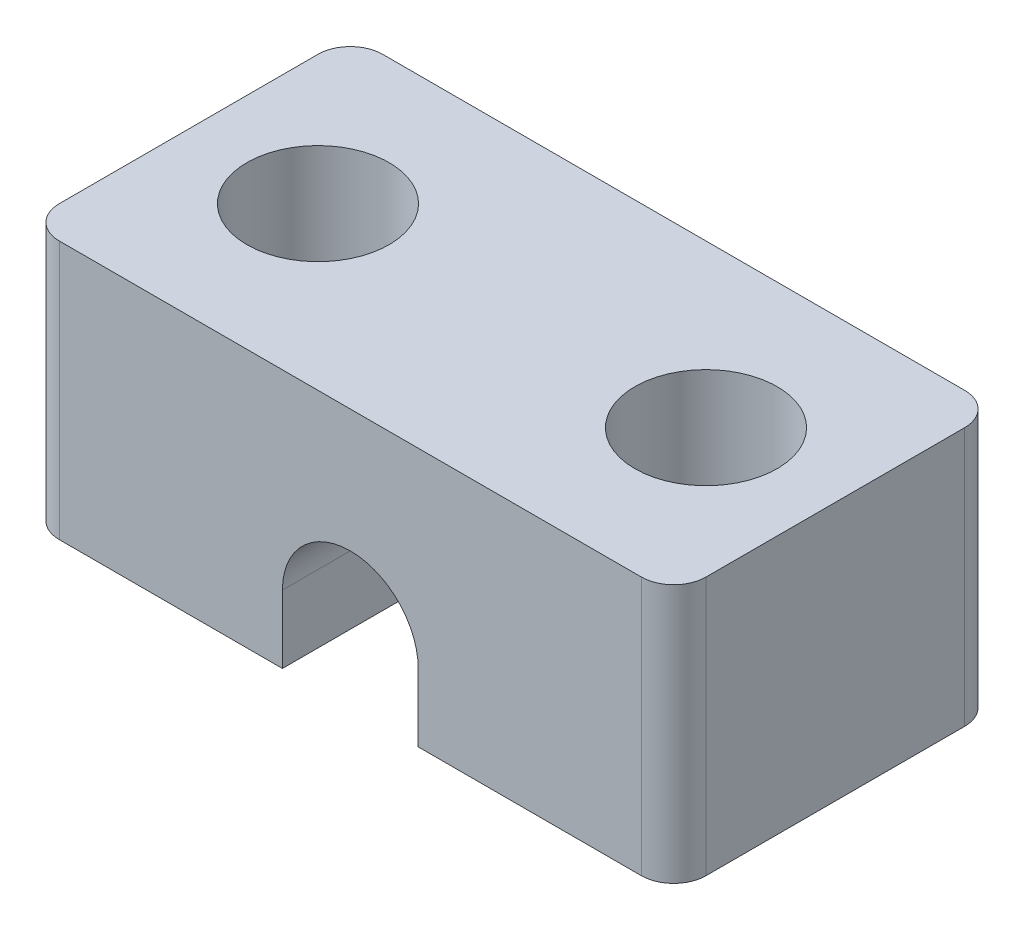
ISO-10303-21;
HEADER;
FILE_DESCRIPTION(('STEP AP214'),'2;1');
FILE_NAME('part.step','',(''),(''),'','','');
FILE_SCHEMA(('AUTOMOTIVE_DESIGN { 1 0 10303 214 1 1 1 1 }'));
ENDSEC;
DATA;
#1=APPLICATION_CONTEXT('core data for automotive mechanical design processes');
#2=APPLICATION_PROTOCOL_DEFINITION('international standard','automotive_design',2000,#1);
#3=PRODUCT_CONTEXT('',#1,'mechanical');
#4=PRODUCT('Part','Part','',(#3));
#5=PRODUCT_RELATED_PRODUCT_CATEGORY('part','',(#4));
#6=PRODUCT_DEFINITION_FORMATION('','',#4);
#7=PRODUCT_DEFINITION_CONTEXT('part definition',#1,'design');
#8=PRODUCT_DEFINITION('design','',#6,#7);
#9=PRODUCT_DEFINITION_SHAPE('','',#8);
#10=(LENGTH_UNIT() NAMED_UNIT(*) SI_UNIT(.MILLI.,.METRE.));
#11=(NAMED_UNIT(*) PLANE_ANGLE_UNIT() SI_UNIT($,.RADIAN.));
#12=(NAMED_UNIT(*) SI_UNIT($,.STERADIAN.) SOLID_ANGLE_UNIT());
#13=UNCERTAINTY_MEASURE_WITH_UNIT(LENGTH_MEASURE(1.E-05),#10,'distance_accuracy_value','');
#14=(GEOMETRIC_REPRESENTATION_CONTEXT(3) GLOBAL_UNCERTAINTY_ASSIGNED_CONTEXT((#13)) GLOBAL_UNIT_ASSIGNED_CONTEXT((#10,
#11,#12)) REPRESENTATION_CONTEXT('',''));
#15=CARTESIAN_POINT('',(0.,0.,0.));
#16=DIRECTION('',(0.,0.,1.));
#17=DIRECTION('',(1.,0.,0.));
#18=AXIS2_PLACEMENT_3D('',#15,#16,#17);
#19=CARTESIAN_POINT('',(-2.1,0.,5.));
#20=DIRECTION('',(-1.,0.,0.));
#21=DIRECTION('',(0.,-1.,0.));
#22=AXIS2_PLACEMENT_3D('',#19,#20,#21);
#23=PLANE('',#22);
#24=DIRECTION('',(0.,1.,0.));
#25=VECTOR('',#24,1.);
#26=CARTESIAN_POINT('',(-2.1,-2.1,0.799999999999999));
#27=LINE('',#26,#25);
#28=CARTESIAN_POINT('',(-2.1,-2.1,0.799999999999999));
#29=VERTEX_POINT('',#28);
#30=CARTESIAN_POINT('',(-2.1,0.,0.799999999999999));
#31=VERTEX_POINT('',#30);
#32=EDGE_CURVE('E261',#29,#31,#27,.T.);
#33=ORIENTED_EDGE('',*,*,#32,.T.);
#34=DIRECTION('',(0.,0.,-1.));
#35=VECTOR('',#34,1.);
#36=CARTESIAN_POINT('',(-2.1,0.,5.));
#37=LINE('',#36,#35);
#38=CARTESIAN_POINT('',(-2.1,0.,5.));
#39=VERTEX_POINT('',#38);
#40=EDGE_CURVE('E148',#39,#31,#37,.T.);
#41=ORIENTED_EDGE('',*,*,#40,.F.);
#42=DIRECTION('',(0.,1.,0.));
#43=VECTOR('',#42,1.);
#44=CARTESIAN_POINT('',(-2.1,0.,5.));
#45=LINE('',#44,#43);
#46=CARTESIAN_POINT('',(-2.1,-2.1,5.));
#47=VERTEX_POINT('',#46);
#48=EDGE_CURVE('E130',#47,#39,#45,.T.);
#49=ORIENTED_EDGE('',*,*,#48,.F.);
#50=DIRECTION('',(0.,0.,-1.));
#51=VECTOR('',#50,1.);
#52=CARTESIAN_POINT('',(-2.1,-2.1,5.));
#53=LINE('',#52,#51);
#54=EDGE_CURVE('E138',#47,#29,#53,.T.);
#55=ORIENTED_EDGE('',*,*,#54,.T.);
#56=EDGE_LOOP('',(#33,#41,#49,#55));
#57=FACE_BOUND('',#56,.T.);
#58=ADVANCED_FACE('F36',(#57),#23,.F.);
#59=CARTESIAN_POINT('',(0.,0.,5.));
#60=DIRECTION('',(0.,0.,-1.));
#61=DIRECTION('',(-1.,0.,0.));
#62=AXIS2_PLACEMENT_3D('',#59,#60,#61);
#63=CYLINDRICAL_SURFACE('',#62,2.1);
#64=CARTESIAN_POINT('',(0.,0.,0.799999999999999));
#65=DIRECTION('',(0.,0.,-1.));
#66=DIRECTION('',(-1.,0.,0.));
#67=AXIS2_PLACEMENT_3D('',#64,#65,#66);
#68=CIRCLE('',#67,2.1);
#69=CARTESIAN_POINT('',(2.1,0.,0.799999999999999));
#70=VERTEX_POINT('',#69);
#71=EDGE_CURVE('E263',#31,#70,#68,.T.);
#72=ORIENTED_EDGE('',*,*,#71,.T.);
#73=DIRECTION('',(0.,0.,-1.));
#74=VECTOR('',#73,1.);
#75=CARTESIAN_POINT('',(2.1,0.,5.));
#76=LINE('',#75,#74);
#77=CARTESIAN_POINT('',(2.1,0.,5.));
#78=VERTEX_POINT('',#77);
#79=EDGE_CURVE('E179',#78,#70,#76,.T.);
#80=ORIENTED_EDGE('',*,*,#79,.F.);
#81=CARTESIAN_POINT('',(0.,0.,5.));
#82=DIRECTION('',(0.,0.,-1.));
#83=DIRECTION('',(1.,0.,0.));
#84=AXIS2_PLACEMENT_3D('',#81,#82,#83);
#85=CIRCLE('',#84,2.1);
#86=EDGE_CURVE('E152',#39,#78,#85,.T.);
#87=ORIENTED_EDGE('',*,*,#86,.F.);
#88=ORIENTED_EDGE('',*,*,#40,.T.);
#89=EDGE_LOOP('',(#72,#80,#87,#88));
#90=FACE_BOUND('',#89,.T.);
#91=ADVANCED_FACE('F227',(#90),#63,.F.);
#92=CARTESIAN_POINT('',(2.1,0.,5.));
#93=DIRECTION('',(1.,0.,0.));
#94=DIRECTION('',(0.,1.,0.));
#95=AXIS2_PLACEMENT_3D('',#92,#93,#94);
#96=PLANE('',#95);
#97=DIRECTION('',(0.,-1.,0.));
#98=VECTOR('',#97,1.);
#99=CARTESIAN_POINT('',(2.1,0.,0.799999999999999));
#100=LINE('',#99,#98);
#101=CARTESIAN_POINT('',(2.1,-2.1,0.799999999999999));
#102=VERTEX_POINT('',#101);
#103=EDGE_CURVE('E258',#70,#102,#100,.T.);
#104=ORIENTED_EDGE('',*,*,#103,.T.);
#105=DIRECTION('',(0.,0.,-1.));
#106=VECTOR('',#105,1.);
#107=CARTESIAN_POINT('',(2.1,-2.1,5.));
#108=LINE('',#107,#106);
#109=CARTESIAN_POINT('',(2.1,-2.1,5.));
#110=VERTEX_POINT('',#109);
#111=EDGE_CURVE('E177',#110,#102,#108,.T.);
#112=ORIENTED_EDGE('',*,*,#111,.F.);
#113=DIRECTION('',(0.,-1.,0.));
#114=VECTOR('',#113,1.);
#115=CARTESIAN_POINT('',(2.1,0.,5.));
#116=LINE('',#115,#114);
#117=EDGE_CURVE('E154',#78,#110,#116,.T.);
#118=ORIENTED_EDGE('',*,*,#117,.F.);
#119=ORIENTED_EDGE('',*,*,#79,.T.);
#120=EDGE_LOOP('',(#104,#112,#118,#119));
#121=FACE_BOUND('',#120,.T.);
#122=ADVANCED_FACE('F232',(#121),#96,.F.);
#123=CARTESIAN_POINT('',(-10.,5.9,5.));
#124=DIRECTION('',(1.,0.,0.));
#125=DIRECTION('',(0.,1.,0.));
#126=AXIS2_PLACEMENT_3D('',#123,#124,#125);
#127=PLANE('',#126);
#128=DIRECTION('',(0.,0.,-1.));
#129=VECTOR('',#128,1.);
#130=CARTESIAN_POINT('',(-10.,5.9,5.));
#131=LINE('',#130,#129);
#132=CARTESIAN_POINT('',(-10.,5.9,4.));
#133=VERTEX_POINT('',#132);
#134=CARTESIAN_POINT('',(-10.,5.9,-4.));
#135=VERTEX_POINT('',#134);
#136=EDGE_CURVE('E163',#133,#135,#131,.T.);
#137=ORIENTED_EDGE('',*,*,#136,.T.);
#138=DIRECTION('',(0.,-1.,0.));
#139=VECTOR('',#138,1.);
#140=CARTESIAN_POINT('',(-10.,5.9,-4.));
#141=LINE('',#140,#139);
#142=CARTESIAN_POINT('',(-10.,-2.1,-4.));
#143=VERTEX_POINT('',#142);
#144=EDGE_CURVE('E11',#135,#143,#141,.T.);
#145=ORIENTED_EDGE('',*,*,#144,.T.);
#146=DIRECTION('',(0.,0.,-1.));
#147=VECTOR('',#146,1.);
#148=CARTESIAN_POINT('',(-10.,-2.1,5.));
#149=LINE('',#148,#147);
#150=CARTESIAN_POINT('',(-10.,-2.1,4.));
#151=VERTEX_POINT('',#150);
#152=EDGE_CURVE('E147',#151,#143,#149,.T.);
#153=ORIENTED_EDGE('',*,*,#152,.F.);
#154=DIRECTION('',(0.,-1.,0.));
#155=VECTOR('',#154,1.);
#156=CARTESIAN_POINT('',(-10.,5.9,4.));
#157=LINE('',#156,#155);
#158=EDGE_CURVE('E44',#151,#133,#157,.F.);
#159=ORIENTED_EDGE('',*,*,#158,.T.);
#160=EDGE_LOOP('',(#137,#145,#153,#159));
#161=FACE_BOUND('',#160,.T.);
#162=ADVANCED_FACE('F213',(#161),#127,.F.);
#163=CARTESIAN_POINT('',(2.1,-2.1,5.));
#164=DIRECTION('',(0.,1.,0.));
#165=DIRECTION('',(0.,0.,1.));
#166=AXIS2_PLACEMENT_3D('',#163,#164,#165);
#167=PLANE('',#166);
#168=CARTESIAN_POINT('',(6.,-2.1,0.));
#169=DIRECTION('',(0.,1.,0.));
#170=DIRECTION('',(0.,0.,1.));
#171=AXIS2_PLACEMENT_3D('',#168,#169,#170);
#172=CIRCLE('',#171,2.2);
#173=CARTESIAN_POINT('',(6.,-2.1,2.2));
#174=VERTEX_POINT('',#173);
#175=EDGE_CURVE('E274',#174,#174,#172,.T.);
#176=ORIENTED_EDGE('',*,*,#175,.T.);
#177=EDGE_LOOP('',(#176));
#178=FACE_BOUND('',#177,.T.);
#179=DIRECTION('',(1.,0.,0.));
#180=VECTOR('',#179,1.);
#181=CARTESIAN_POINT('',(2.1,-2.1,-5.));
#182=LINE('',#181,#180);
#183=CARTESIAN_POINT('',(-9.,-2.1,-5.));
#184=VERTEX_POINT('',#183);
#185=CARTESIAN_POINT('',(9.,-2.1,-5.));
#186=VERTEX_POINT('',#185);
#187=EDGE_CURVE('E164',#184,#186,#182,.T.);
#188=ORIENTED_EDGE('',*,*,#187,.T.);
#189=CARTESIAN_POINT('',(9.,-2.1,-4.));
#190=DIRECTION('',(0.,1.,0.));
#191=DIRECTION('',(0.,0.,1.));
#192=AXIS2_PLACEMENT_3D('',#189,#190,#191);
#193=CIRCLE('',#192,1.);
#194=CARTESIAN_POINT('',(10.,-2.1,-4.));
#195=VERTEX_POINT('',#194);
#196=EDGE_CURVE('E205',#186,#195,#193,.F.);
#197=ORIENTED_EDGE('',*,*,#196,.T.);
#198=DIRECTION('',(0.,0.,-1.));
#199=VECTOR('',#198,1.);
#200=CARTESIAN_POINT('',(10.,-2.1,5.));
#201=LINE('',#200,#199);
#202=CARTESIAN_POINT('',(10.,-2.1,4.));
#203=VERTEX_POINT('',#202);
#204=EDGE_CURVE('E174',#203,#195,#201,.T.);
#205=ORIENTED_EDGE('',*,*,#204,.F.);
#206=CARTESIAN_POINT('',(9.,-2.1,4.));
#207=DIRECTION('',(0.,1.,0.));
#208=DIRECTION('',(0.,0.,1.));
#209=AXIS2_PLACEMENT_3D('',#206,#207,#208);
#210=CIRCLE('',#209,1.);
#211=CARTESIAN_POINT('',(9.,-2.1,5.));
#212=VERTEX_POINT('',#211);
#213=EDGE_CURVE('E203',#203,#212,#210,.F.);
#214=ORIENTED_EDGE('',*,*,#213,.T.);
#215=DIRECTION('',(1.,0.,0.));
#216=VECTOR('',#215,1.);
#217=CARTESIAN_POINT('',(2.1,-2.1,5.));
#218=LINE('',#217,#216);
#219=EDGE_CURVE('E159',#110,#212,#218,.T.);
#220=ORIENTED_EDGE('',*,*,#219,.F.);
#221=ORIENTED_EDGE('',*,*,#111,.T.);
#222=DIRECTION('',(-1.,0.,0.));
#223=VECTOR('',#222,1.);
#224=CARTESIAN_POINT('',(2.1,-2.1,0.799999999999999));
#225=LINE('',#224,#223);
#226=EDGE_CURVE('E144',#102,#29,#225,.T.);
#227=ORIENTED_EDGE('',*,*,#226,.T.);
#228=ORIENTED_EDGE('',*,*,#54,.F.);
#229=DIRECTION('',(1.,0.,0.));
#230=VECTOR('',#229,1.);
#231=CARTESIAN_POINT('',(-10.,-2.1,5.));
#232=LINE('',#231,#230);
#233=CARTESIAN_POINT('',(-9.,-2.1,5.));
#234=VERTEX_POINT('',#233);
#235=EDGE_CURVE('E125',#234,#47,#232,.T.);
#236=ORIENTED_EDGE('',*,*,#235,.F.);
#237=CARTESIAN_POINT('',(-9.,-2.1,4.));
#238=DIRECTION('',(0.,1.,0.));
#239=DIRECTION('',(0.,0.,1.));
#240=AXIS2_PLACEMENT_3D('',#237,#238,#239);
#241=CIRCLE('',#240,1.);
#242=EDGE_CURVE('E58',#234,#151,#241,.F.);
#243=ORIENTED_EDGE('',*,*,#242,.T.);
#244=ORIENTED_EDGE('',*,*,#152,.T.);
#245=CARTESIAN_POINT('',(-9.,-2.1,-4.));
#246=DIRECTION('',(0.,1.,0.));
#247=DIRECTION('',(0.,0.,1.));
#248=AXIS2_PLACEMENT_3D('',#245,#246,#247);
#249=CIRCLE('',#248,1.);
#250=EDGE_CURVE('E51',#143,#184,#249,.F.);
#251=ORIENTED_EDGE('',*,*,#250,.T.);
#252=EDGE_LOOP('',(#188,#197,#205,#214,#220,#221,#227,#228,#236,#243,#244,#251));
#253=FACE_BOUND('',#252,.T.);
#254=CARTESIAN_POINT('',(-6.,-2.1,0.));
#255=DIRECTION('',(0.,1.,0.));
#256=DIRECTION('',(0.,0.,1.));
#257=AXIS2_PLACEMENT_3D('',#254,#255,#256);
#258=CIRCLE('',#257,2.2);
#259=CARTESIAN_POINT('',(-6.,-2.1,2.2));
#260=VERTEX_POINT('',#259);
#261=EDGE_CURVE('E166',#260,#260,#258,.T.);
#262=ORIENTED_EDGE('',*,*,#261,.T.);
#263=EDGE_LOOP('',(#262));
#264=FACE_BOUND('',#263,.T.);
#265=ADVANCED_FACE('F140',(#178,#253,#264),#167,.F.);
#266=CARTESIAN_POINT('',(10.,5.9,5.));
#267=DIRECTION('',(-1.,0.,0.));
#268=DIRECTION('',(0.,-1.,0.));
#269=AXIS2_PLACEMENT_3D('',#266,#267,#268);
#270=PLANE('',#269);
#271=ORIENTED_EDGE('',*,*,#204,.T.);
#272=DIRECTION('',(0.,1.,0.));
#273=VECTOR('',#272,1.);
#274=CARTESIAN_POINT('',(10.,5.9,-4.));
#275=LINE('',#274,#273);
#276=CARTESIAN_POINT('',(10.,5.9,-4.));
#277=VERTEX_POINT('',#276);
#278=EDGE_CURVE('E186',#195,#277,#275,.T.);
#279=ORIENTED_EDGE('',*,*,#278,.T.);
#280=DIRECTION('',(0.,0.,-1.));
#281=VECTOR('',#280,1.);
#282=CARTESIAN_POINT('',(10.,5.9,5.));
#283=LINE('',#282,#281);
#284=CARTESIAN_POINT('',(10.,5.9,4.));
#285=VERTEX_POINT('',#284);
#286=EDGE_CURVE('E171',#285,#277,#283,.T.);
#287=ORIENTED_EDGE('',*,*,#286,.F.);
#288=DIRECTION('',(0.,1.,0.));
#289=VECTOR('',#288,1.);
#290=CARTESIAN_POINT('',(10.,-2.1,4.));
#291=LINE('',#290,#289);
#292=EDGE_CURVE('E184',#285,#203,#291,.F.);
#293=ORIENTED_EDGE('',*,*,#292,.T.);
#294=EDGE_LOOP('',(#271,#279,#287,#293));
#295=FACE_BOUND('',#294,.T.);
#296=ADVANCED_FACE('F282',(#295),#270,.F.);
#297=CARTESIAN_POINT('',(-10.,5.9,5.));
#298=DIRECTION('',(0.,-1.,0.));
#299=DIRECTION('',(0.,0.,-1.));
#300=AXIS2_PLACEMENT_3D('',#297,#298,#299);
#301=PLANE('',#300);
#302=CARTESIAN_POINT('',(-6.,5.9,0.));
#303=DIRECTION('',(0.,1.,0.));
#304=DIRECTION('',(0.,0.,1.));
#305=AXIS2_PLACEMENT_3D('',#302,#303,#304);
#306=CIRCLE('',#305,2.2);
#307=CARTESIAN_POINT('',(-6.,5.9,2.2));
#308=VERTEX_POINT('',#307);
#309=EDGE_CURVE('E271',#308,#308,#306,.T.);
#310=ORIENTED_EDGE('',*,*,#309,.F.);
#311=EDGE_LOOP('',(#310));
#312=FACE_BOUND('',#311,.T.);
#313=CARTESIAN_POINT('',(6.,5.9,0.));
#314=DIRECTION('',(0.,1.,0.));
#315=DIRECTION('',(0.,0.,1.));
#316=AXIS2_PLACEMENT_3D('',#313,#314,#315);
#317=CIRCLE('',#316,2.2);
#318=CARTESIAN_POINT('',(6.,5.9,2.2));
#319=VERTEX_POINT('',#318);
#320=EDGE_CURVE('E268',#319,#319,#317,.T.);
#321=ORIENTED_EDGE('',*,*,#320,.F.);
#322=EDGE_LOOP('',(#321));
#323=FACE_BOUND('',#322,.T.);
#324=ORIENTED_EDGE('',*,*,#286,.T.);
#325=CARTESIAN_POINT('',(9.,5.9,-4.));
#326=DIRECTION('',(0.,-1.,0.));
#327=DIRECTION('',(0.,0.,-1.));
#328=AXIS2_PLACEMENT_3D('',#325,#326,#327);
#329=CIRCLE('',#328,1.);
#330=CARTESIAN_POINT('',(9.,5.9,-5.));
#331=VERTEX_POINT('',#330);
#332=EDGE_CURVE('E195',#277,#331,#329,.F.);
#333=ORIENTED_EDGE('',*,*,#332,.T.);
#334=DIRECTION('',(-1.,0.,0.));
#335=VECTOR('',#334,1.);
#336=CARTESIAN_POINT('',(-10.,5.9,-5.));
#337=LINE('',#336,#335);
#338=CARTESIAN_POINT('',(-9.,5.9,-5.));
#339=VERTEX_POINT('',#338);
#340=EDGE_CURVE('E135',#331,#339,#337,.T.);
#341=ORIENTED_EDGE('',*,*,#340,.T.);
#342=CARTESIAN_POINT('',(-9.,5.9,-4.));
#343=DIRECTION('',(0.,-1.,0.));
#344=DIRECTION('',(0.,0.,-1.));
#345=AXIS2_PLACEMENT_3D('',#342,#343,#344);
#346=CIRCLE('',#345,1.);
#347=EDGE_CURVE('E191',#339,#135,#346,.F.);
#348=ORIENTED_EDGE('',*,*,#347,.T.);
#349=ORIENTED_EDGE('',*,*,#136,.F.);
#350=CARTESIAN_POINT('',(-9.,5.9,4.));
#351=DIRECTION('',(0.,-1.,0.));
#352=DIRECTION('',(0.,0.,-1.));
#353=AXIS2_PLACEMENT_3D('',#350,#351,#352);
#354=CIRCLE('',#353,1.);
#355=CARTESIAN_POINT('',(-9.,5.9,5.));
#356=VERTEX_POINT('',#355);
#357=EDGE_CURVE('E189',#133,#356,#354,.F.);
#358=ORIENTED_EDGE('',*,*,#357,.T.);
#359=DIRECTION('',(-1.,0.,0.));
#360=VECTOR('',#359,1.);
#361=CARTESIAN_POINT('',(-10.,5.9,5.));
#362=LINE('',#361,#360);
#363=CARTESIAN_POINT('',(9.,5.9,5.));
#364=VERTEX_POINT('',#363);
#365=EDGE_CURVE('E161',#364,#356,#362,.T.);
#366=ORIENTED_EDGE('',*,*,#365,.F.);
#367=CARTESIAN_POINT('',(9.,5.9,4.));
#368=DIRECTION('',(0.,-1.,0.));
#369=DIRECTION('',(0.,0.,-1.));
#370=AXIS2_PLACEMENT_3D('',#367,#368,#369);
#371=CIRCLE('',#370,1.);
#372=EDGE_CURVE('E193',#364,#285,#371,.F.);
#373=ORIENTED_EDGE('',*,*,#372,.T.);
#374=EDGE_LOOP('',(#324,#333,#341,#348,#349,#358,#366,#373));
#375=FACE_BOUND('',#374,.T.);
#376=ADVANCED_FACE('F217',(#312,#323,#375),#301,.F.);
#377=CARTESIAN_POINT('',(0.,0.,5.));
#378=DIRECTION('',(0.,0.,1.));
#379=DIRECTION('',(1.,0.,0.));
#380=AXIS2_PLACEMENT_3D('',#377,#378,#379);
#381=PLANE('',#380);
#382=ORIENTED_EDGE('',*,*,#219,.T.);
#383=DIRECTION('',(0.,1.,0.));
#384=VECTOR('',#383,1.);
#385=CARTESIAN_POINT('',(9.,5.9,5.));
#386=LINE('',#385,#384);
#387=EDGE_CURVE('E208',#212,#364,#386,.T.);
#388=ORIENTED_EDGE('',*,*,#387,.T.);
#389=ORIENTED_EDGE('',*,*,#365,.T.);
#390=DIRECTION('',(0.,-1.,0.));
#391=VECTOR('',#390,1.);
#392=CARTESIAN_POINT('',(-9.,-2.1,5.));
#393=LINE('',#392,#391);
#394=EDGE_CURVE('E134',#356,#234,#393,.T.);
#395=ORIENTED_EDGE('',*,*,#394,.T.);
#396=ORIENTED_EDGE('',*,*,#235,.T.);
#397=ORIENTED_EDGE('',*,*,#48,.T.);
#398=ORIENTED_EDGE('',*,*,#86,.T.);
#399=ORIENTED_EDGE('',*,*,#117,.T.);
#400=EDGE_LOOP('',(#382,#388,#389,#395,#396,#397,#398,#399));
#401=FACE_BOUND('',#400,.T.);
#402=ADVANCED_FACE('F128',(#401),#381,.T.);
#403=CARTESIAN_POINT('',(0.,0.,-5.));
#404=DIRECTION('',(0.,0.,1.));
#405=DIRECTION('',(1.,0.,0.));
#406=AXIS2_PLACEMENT_3D('',#403,#404,#405);
#407=PLANE('',#406);
#408=ORIENTED_EDGE('',*,*,#340,.F.);
#409=DIRECTION('',(0.,1.,0.));
#410=VECTOR('',#409,1.);
#411=CARTESIAN_POINT('',(9.,0.,-5.));
#412=LINE('',#411,#410);
#413=EDGE_CURVE('E199',#331,#186,#412,.F.);
#414=ORIENTED_EDGE('',*,*,#413,.T.);
#415=ORIENTED_EDGE('',*,*,#187,.F.);
#416=DIRECTION('',(0.,-1.,0.));
#417=VECTOR('',#416,1.);
#418=CARTESIAN_POINT('',(-9.,0.,-5.));
#419=LINE('',#418,#417);
#420=EDGE_CURVE('E197',#184,#339,#419,.F.);
#421=ORIENTED_EDGE('',*,*,#420,.T.);
#422=EDGE_LOOP('',(#408,#414,#415,#421));
#423=FACE_BOUND('',#422,.T.);
#424=ADVANCED_FACE('F289',(#423),#407,.F.);
#425=CARTESIAN_POINT('',(6.,-2.1,0.));
#426=DIRECTION('',(0.,1.,0.));
#427=DIRECTION('',(0.,0.,1.));
#428=AXIS2_PLACEMENT_3D('',#425,#426,#427);
#429=CYLINDRICAL_SURFACE('',#428,2.2);
#430=ORIENTED_EDGE('',*,*,#175,.F.);
#431=EDGE_LOOP('',(#430));
#432=FACE_BOUND('',#431,.T.);
#433=ORIENTED_EDGE('',*,*,#320,.T.);
#434=EDGE_LOOP('',(#433));
#435=FACE_BOUND('',#434,.T.);
#436=ADVANCED_FACE('F279',(#432,#435),#429,.F.);
#437=CARTESIAN_POINT('',(-6.,-2.1,0.));
#438=DIRECTION('',(0.,1.,0.));
#439=DIRECTION('',(0.,0.,1.));
#440=AXIS2_PLACEMENT_3D('',#437,#438,#439);
#441=CYLINDRICAL_SURFACE('',#440,2.2);
#442=ORIENTED_EDGE('',*,*,#261,.F.);
#443=EDGE_LOOP('',(#442));
#444=FACE_BOUND('',#443,.T.);
#445=ORIENTED_EDGE('',*,*,#309,.T.);
#446=EDGE_LOOP('',(#445));
#447=FACE_BOUND('',#446,.T.);
#448=ADVANCED_FACE('F365',(#444,#447),#441,.F.);
#449=CARTESIAN_POINT('',(0.,0.,0.799999999999999));
#450=DIRECTION('',(0.,0.,-1.));
#451=DIRECTION('',(-1.,0.,0.));
#452=AXIS2_PLACEMENT_3D('',#449,#450,#451);
#453=PLANE('',#452);
#454=ORIENTED_EDGE('',*,*,#226,.F.);
#455=ORIENTED_EDGE('',*,*,#103,.F.);
#456=ORIENTED_EDGE('',*,*,#71,.F.);
#457=ORIENTED_EDGE('',*,*,#32,.F.);
#458=EDGE_LOOP('',(#454,#455,#456,#457));
#459=FACE_BOUND('',#458,.T.);
#460=ADVANCED_FACE('F242',(#459),#453,.F.);
#461=CARTESIAN_POINT('',(9.,5.9,-4.));
#462=DIRECTION('',(0.,1.,0.));
#463=DIRECTION('',(-1.,0.,0.));
#464=AXIS2_PLACEMENT_3D('',#461,#462,#463);
#465=CYLINDRICAL_SURFACE('',#464,1.);
#466=ORIENTED_EDGE('',*,*,#196,.F.);
#467=ORIENTED_EDGE('',*,*,#413,.F.);
#468=ORIENTED_EDGE('',*,*,#332,.F.);
#469=ORIENTED_EDGE('',*,*,#278,.F.);
#470=EDGE_LOOP('',(#466,#467,#468,#469));
#471=FACE_BOUND('',#470,.T.);
#472=ADVANCED_FACE('F239',(#471),#465,.T.);
#473=CARTESIAN_POINT('',(9.,0.,4.));
#474=DIRECTION('',(0.,-1.,0.));
#475=DIRECTION('',(1.,0.,0.));
#476=AXIS2_PLACEMENT_3D('',#473,#474,#475);
#477=CYLINDRICAL_SURFACE('',#476,1.);
#478=ORIENTED_EDGE('',*,*,#213,.F.);
#479=ORIENTED_EDGE('',*,*,#292,.F.);
#480=ORIENTED_EDGE('',*,*,#372,.F.);
#481=ORIENTED_EDGE('',*,*,#387,.F.);
#482=EDGE_LOOP('',(#478,#479,#480,#481));
#483=FACE_BOUND('',#482,.T.);
#484=ADVANCED_FACE('F225',(#483),#477,.T.);
#485=CARTESIAN_POINT('',(-9.,5.9,-4.));
#486=DIRECTION('',(0.,-1.,0.));
#487=DIRECTION('',(1.,0.,0.));
#488=AXIS2_PLACEMENT_3D('',#485,#486,#487);
#489=CYLINDRICAL_SURFACE('',#488,1.);
#490=ORIENTED_EDGE('',*,*,#347,.F.);
#491=ORIENTED_EDGE('',*,*,#420,.F.);
#492=ORIENTED_EDGE('',*,*,#250,.F.);
#493=ORIENTED_EDGE('',*,*,#144,.F.);
#494=EDGE_LOOP('',(#490,#491,#492,#493));
#495=FACE_BOUND('',#494,.T.);
#496=ADVANCED_FACE('F221',(#495),#489,.T.);
#497=CARTESIAN_POINT('',(-9.,0.,4.));
#498=DIRECTION('',(0.,1.,0.));
#499=DIRECTION('',(-1.,0.,0.));
#500=AXIS2_PLACEMENT_3D('',#497,#498,#499);
#501=CYLINDRICAL_SURFACE('',#500,1.);
#502=ORIENTED_EDGE('',*,*,#357,.F.);
#503=ORIENTED_EDGE('',*,*,#158,.F.);
#504=ORIENTED_EDGE('',*,*,#242,.F.);
#505=ORIENTED_EDGE('',*,*,#394,.F.);
#506=EDGE_LOOP('',(#502,#503,#504,#505));
#507=FACE_BOUND('',#506,.T.);
#508=ADVANCED_FACE('F38',(#507),#501,.T.);
#509=CLOSED_SHELL('',(#58,#91,#122,#162,#265,#296,#376,#402,#424,#436,#448,#460,#472,#484,#496,#508));
#510=MANIFOLD_SOLID_BREP('B2',#509);
#511=ADVANCED_BREP_SHAPE_REPRESENTATION('',(#18,#510),#14);
#512=SHAPE_DEFINITION_REPRESENTATION(#9,#511);
ENDSEC;
END-ISO-10303-21;
